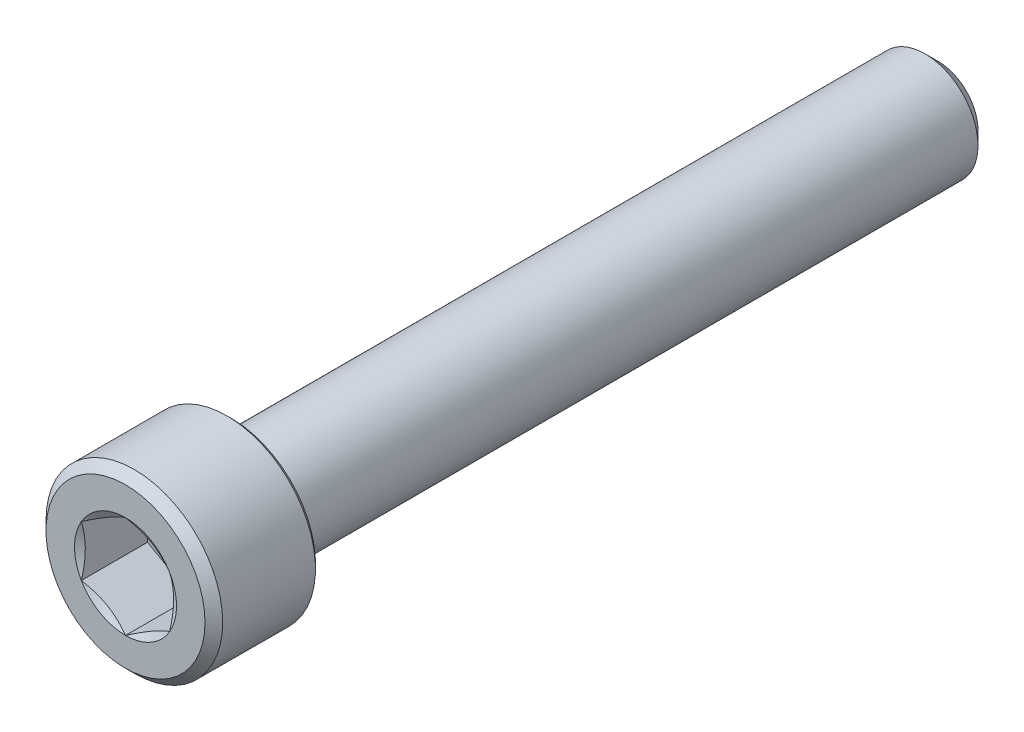
ISO-10303-21;
HEADER;
FILE_DESCRIPTION(('STEP AP214'),'2;1');
FILE_NAME('part.step','',(''),(''),'','','');
FILE_SCHEMA(('AUTOMOTIVE_DESIGN { 1 0 10303 214 1 1 1 1 }'));
ENDSEC;
DATA;
#1=APPLICATION_CONTEXT('core data for automotive mechanical design processes');
#2=APPLICATION_PROTOCOL_DEFINITION('international standard','automotive_design',2000,#1);
#3=PRODUCT_CONTEXT('',#1,'mechanical');
#4=PRODUCT('Part','Part','',(#3));
#5=PRODUCT_RELATED_PRODUCT_CATEGORY('part','',(#4));
#6=PRODUCT_DEFINITION_FORMATION('','',#4);
#7=PRODUCT_DEFINITION_CONTEXT('part definition',#1,'design');
#8=PRODUCT_DEFINITION('design','',#6,#7);
#9=PRODUCT_DEFINITION_SHAPE('','',#8);
#10=(LENGTH_UNIT() NAMED_UNIT(*) SI_UNIT(.MILLI.,.METRE.));
#11=(NAMED_UNIT(*) PLANE_ANGLE_UNIT() SI_UNIT($,.RADIAN.));
#12=(NAMED_UNIT(*) SI_UNIT($,.STERADIAN.) SOLID_ANGLE_UNIT());
#13=UNCERTAINTY_MEASURE_WITH_UNIT(LENGTH_MEASURE(1.E-05),#10,'distance_accuracy_value','');
#14=(GEOMETRIC_REPRESENTATION_CONTEXT(3) GLOBAL_UNCERTAINTY_ASSIGNED_CONTEXT((#13)) GLOBAL_UNIT_ASSIGNED_CONTEXT((#10,
#11,#12)) REPRESENTATION_CONTEXT('',''));
#15=CARTESIAN_POINT('',(0.,0.,0.));
#16=DIRECTION('',(0.,0.,1.));
#17=DIRECTION('',(1.,0.,0.));
#18=AXIS2_PLACEMENT_3D('',#15,#16,#17);
#19=CARTESIAN_POINT('',(-4.75000000000003,0.,17.));
#20=DIRECTION('',(0.,0.,-1.));
#21=DIRECTION('',(-1.,0.,0.));
#22=AXIS2_PLACEMENT_3D('',#19,#20,#21);
#23=PLANE('',#22);
#24=CARTESIAN_POINT('',(0.,0.,17.));
#25=DIRECTION('',(0.,0.,-1.));
#26=DIRECTION('',(-1.,0.,0.));
#27=AXIS2_PLACEMENT_3D('',#24,#25,#26);
#28=CIRCLE('',#27,3.);
#29=CARTESIAN_POINT('',(-3.,0.,17.));
#30=VERTEX_POINT('',#29);
#31=EDGE_CURVE('E12',#30,#30,#28,.T.);
#32=ORIENTED_EDGE('',*,*,#31,.F.);
#33=EDGE_LOOP('',(#32));
#34=FACE_BOUND('',#33,.T.);
#35=CARTESIAN_POINT('',(0.,0.,17.));
#36=DIRECTION('',(0.,0.,-1.));
#37=DIRECTION('',(-1.,0.,0.));
#38=AXIS2_PLACEMENT_3D('',#35,#36,#37);
#39=CIRCLE('',#38,4.74999999999999);
#40=CARTESIAN_POINT('',(-4.74999999999999,0.,17.));
#41=VERTEX_POINT('',#40);
#42=EDGE_CURVE('E289',#41,#41,#39,.T.);
#43=ORIENTED_EDGE('',*,*,#42,.T.);
#44=EDGE_LOOP('',(#43));
#45=FACE_BOUND('',#44,.T.);
#46=ADVANCED_FACE('F43',(#34,#45),#23,.T.);
#47=CARTESIAN_POINT('',(0.,0.,19.25));
#48=DIRECTION('',(0.,0.,1.));
#49=DIRECTION('',(1.,0.,0.));
#50=AXIS2_PLACEMENT_3D('',#47,#48,#49);
#51=PLANE('',#50);
#52=DIRECTION('',(-0.866025403784439,0.5,0.));
#53=VECTOR('',#52,1.);
#54=CARTESIAN_POINT('',(2.50000000000006,1.44337567297405,19.25));
#55=LINE('',#54,#53);
#56=CARTESIAN_POINT('',(2.50000000000006,1.44337567297405,19.25));
#57=VERTEX_POINT('',#56);
#58=CARTESIAN_POINT('',(0.,2.88675134594812,19.25));
#59=VERTEX_POINT('',#58);
#60=EDGE_CURVE('E112',#57,#59,#55,.T.);
#61=ORIENTED_EDGE('',*,*,#60,.T.);
#62=DIRECTION('',(-0.866025403784438,-0.5,0.));
#63=VECTOR('',#62,1.);
#64=CARTESIAN_POINT('',(0.,2.88675134594812,19.25));
#65=LINE('',#64,#63);
#66=CARTESIAN_POINT('',(-2.49999999999995,1.44337567297406,19.25));
#67=VERTEX_POINT('',#66);
#68=EDGE_CURVE('E240',#59,#67,#65,.T.);
#69=ORIENTED_EDGE('',*,*,#68,.T.);
#70=DIRECTION('',(0.,-1.,0.));
#71=VECTOR('',#70,1.);
#72=CARTESIAN_POINT('',(-2.49999999999995,1.44337567297406,19.25));
#73=LINE('',#72,#71);
#74=CARTESIAN_POINT('',(-2.49999999999995,-1.44337567297408,19.25));
#75=VERTEX_POINT('',#74);
#76=EDGE_CURVE('E246',#67,#75,#73,.T.);
#77=ORIENTED_EDGE('',*,*,#76,.T.);
#78=DIRECTION('',(0.866025403784439,-0.5,0.));
#79=VECTOR('',#78,1.);
#80=CARTESIAN_POINT('',(-2.49999999999995,-1.44337567297408,19.25));
#81=LINE('',#80,#79);
#82=CARTESIAN_POINT('',(0.,-2.88675134594814,19.2499999999994));
#83=VERTEX_POINT('',#82);
#84=EDGE_CURVE('E249',#75,#83,#81,.T.);
#85=ORIENTED_EDGE('',*,*,#84,.T.);
#86=DIRECTION('',(0.866025403784439,0.5,0.));
#87=VECTOR('',#86,1.);
#88=CARTESIAN_POINT('',(0.,-2.88675134594814,19.2499999999994));
#89=LINE('',#88,#87);
#90=CARTESIAN_POINT('',(2.50000000000006,-1.44337567297409,19.25));
#91=VERTEX_POINT('',#90);
#92=EDGE_CURVE('E255',#83,#91,#89,.T.);
#93=ORIENTED_EDGE('',*,*,#92,.T.);
#94=DIRECTION('',(0.,1.,0.));
#95=VECTOR('',#94,1.);
#96=CARTESIAN_POINT('',(2.50000000000006,-1.44337567297409,19.25));
#97=LINE('',#96,#95);
#98=EDGE_CURVE('E242',#91,#57,#97,.T.);
#99=ORIENTED_EDGE('',*,*,#98,.T.);
#100=EDGE_LOOP('',(#61,#69,#77,#85,#93,#99));
#101=FACE_BOUND('',#100,.T.);
#102=ADVANCED_FACE('F229',(#101),#51,.T.);
#103=CARTESIAN_POINT('',(0.,2.88675134594812,19.25));
#104=DIRECTION('',(-0.5,0.866025403784438,0.));
#105=DIRECTION('',(-0.866025403784438,-0.5,0.));
#106=AXIS2_PLACEMENT_3D('',#103,#104,#105);
#107=PLANE('',#106);
#108=DIRECTION('',(0.,0.,1.));
#109=VECTOR('',#108,1.);
#110=CARTESIAN_POINT('',(0.,2.88675134594812,19.25));
#111=LINE('',#110,#109);
#112=CARTESIAN_POINT('',(0.,2.88675134594819,22.9999999999999));
#113=VERTEX_POINT('',#112);
#114=EDGE_CURVE('E66',#59,#113,#111,.T.);
#115=ORIENTED_EDGE('',*,*,#114,.T.);
#116=CARTESIAN_POINT('',(0.000199999999894729,2.88686681600205,23.0000666706665));
#117=CARTESIAN_POINT('',(-0.10966323473493,2.82343724785376,22.963430626415));
#118=CARTESIAN_POINT('',(-0.22047479989656,2.75946016087833,22.9301112252724));
#119=CARTESIAN_POINT('',(-0.444016833466083,2.63039810762174,22.8719512918652));
#120=CARTESIAN_POINT('',(-0.556751274528445,2.56531084772745,22.8471313354551));
#121=CARTESIAN_POINT('',(-0.780822993875343,2.43594298024475,22.8084946577485));
#122=CARTESIAN_POINT('',(-0.892125791767446,2.37168227992019,22.7944208024932));
#123=CARTESIAN_POINT('',(-1.11525522746837,2.24285844015412,22.77761815866));
#124=CARTESIAN_POINT('',(-1.22708105401424,2.1782957690955,22.7748754575104));
#125=CARTESIAN_POINT('',(-1.43604197555149,2.05765212479586,22.7805747663149));
#126=CARTESIAN_POINT('',(-1.53320831755768,2.00155311108242,22.7876174006891));
#127=CARTESIAN_POINT('',(-1.72690794971093,1.88972057631682,22.8099404254325));
#128=CARTESIAN_POINT('',(-1.82344056965966,1.83398744220384,22.8252284447477));
#129=CARTESIAN_POINT('',(-2.01753972174042,1.72192424450053,22.8634481001518));
#130=CARTESIAN_POINT('',(-2.1150816817821,1.66560836761318,22.8865417824329));
#131=CARTESIAN_POINT('',(-2.30871060807606,1.55381665489446,22.9389556628853));
#132=CARTESIAN_POINT('',(-2.40480005588614,1.49833938633503,22.968263541932));
#133=CARTESIAN_POINT('',(-2.50019999999995,1.44326020292024,23.0000666706666));
#134=B_SPLINE_CURVE_WITH_KNOTS('',3,(#116,#117,#118,#119,#120,#121,#122,#123,#124,#125,#126,
#127,#128,#129,#130,#131,#132,#133),.UNSPECIFIED.,.F.,.F.,(4,2,2,2,2,2,2,2,4),(0.,
0.396285827362194,0.793524330152086,1.18093086852115,1.5678616013447,1.90479741793724,
2.24204551660453,2.58677531536753,2.93082800105252),.UNSPECIFIED.);
#135=CARTESIAN_POINT('',(-2.49999999999995,1.44337567297408,23.));
#136=VERTEX_POINT('',#135);
#137=EDGE_CURVE('E127',#113,#136,#134,.T.);
#138=ORIENTED_EDGE('',*,*,#137,.T.);
#139=DIRECTION('',(0.,0.,1.));
#140=VECTOR('',#139,1.);
#141=CARTESIAN_POINT('',(-2.49999999999995,1.44337567297406,19.25));
#142=LINE('',#141,#140);
#143=EDGE_CURVE('E269',#67,#136,#142,.T.);
#144=ORIENTED_EDGE('',*,*,#143,.F.);
#145=ORIENTED_EDGE('',*,*,#68,.F.);
#146=EDGE_LOOP('',(#115,#138,#144,#145));
#147=FACE_BOUND('',#146,.T.);
#148=ADVANCED_FACE('F167',(#147),#107,.F.);
#149=CARTESIAN_POINT('',(-2.49999999999995,1.44337567297406,19.25));
#150=DIRECTION('',(-1.,0.,0.));
#151=DIRECTION('',(0.,-1.,0.));
#152=AXIS2_PLACEMENT_3D('',#149,#150,#151);
#153=PLANE('',#152);
#154=ORIENTED_EDGE('',*,*,#143,.T.);
#155=CARTESIAN_POINT('',(-2.49999999999995,-3.73786280358436,23.9295882218481));
#156=CARTESIAN_POINT('',(-2.49999999999995,-3.6299041938339,23.8777937660757));
#157=CARTESIAN_POINT('',(-2.49999999999995,-3.5216825821562,23.8265372889182));
#158=CARTESIAN_POINT('',(-2.49999999999995,-3.3045731818414,23.725405478066));
#159=CARTESIAN_POINT('',(-2.49999999999995,-3.19568527756434,23.67553039293));
#160=CARTESIAN_POINT('',(-2.49999999999995,-2.97647878742819,23.57718792422));
#161=CARTESIAN_POINT('',(-2.49999999999995,-2.86615552972882,23.5287309150564));
#162=CARTESIAN_POINT('',(-2.49999999999995,-2.64458325378208,23.4339898302576));
#163=CARTESIAN_POINT('',(-2.49999999999995,-2.53333428402513,23.3877056416391));
#164=CARTESIAN_POINT('',(-2.49999999999994,-2.30680312539528,23.2967102106624));
#165=CARTESIAN_POINT('',(-2.49999999999994,-2.19149153465735,23.2520717337127));
#166=CARTESIAN_POINT('',(-2.49999999999995,-1.95947357141998,23.1665060597908));
#167=CARTESIAN_POINT('',(-2.49999999999995,-1.84276703891858,23.1255792932719));
#168=CARTESIAN_POINT('',(-2.49999999999994,-1.60804308504337,23.0486074115298));
#169=CARTESIAN_POINT('',(-2.49999999999992,-1.4900294060755,23.0125510068305));
#170=CARTESIAN_POINT('',(-2.49999999999998,-1.25231072628281,22.9465529230494));
#171=CARTESIAN_POINT('',(-2.50000000000006,-1.13260615342754,22.9166097253317));
#172=CARTESIAN_POINT('',(-2.50000000000006,-0.891755040559598,22.8644342528939));
#173=CARTESIAN_POINT('',(-2.49999999999998,-0.770611999342791,22.8421861409444));
#174=CARTESIAN_POINT('',(-2.49999999999992,-0.526970585180102,22.8068576846702));
#175=CARTESIAN_POINT('',(-2.49999999999994,-0.404472304392252,22.7937767208128));
#176=CARTESIAN_POINT('',(-2.49999999999995,-0.160266398285745,22.7779962179178));
#177=CARTESIAN_POINT('',(-2.49999999999995,-0.0385668852681152,22.7751741710629));
#178=CARTESIAN_POINT('',(-2.49999999999994,0.204641911565312,22.779835787442));
#179=CARTESIAN_POINT('',(-2.49999999999995,0.326151183135712,22.7873200888061));
#180=CARTESIAN_POINT('',(-2.49999999999995,0.536550507375678,22.8086986241475));
#181=CARTESIAN_POINT('',(-2.49999999999995,0.625673194353573,22.8204088062497));
#182=CARTESIAN_POINT('',(-2.49999999999995,0.803173287782045,22.8485682080933));
#183=CARTESIAN_POINT('',(-2.49999999999995,0.891550562549707,22.8650182478381));
#184=CARTESIAN_POINT('',(-2.49999999999995,1.15551872114666,22.920608136683));
#185=CARTESIAN_POINT('',(-2.49999999999995,1.3298084508478,22.9659720627379));
#186=CARTESIAN_POINT('',(-2.49999999999995,1.59042392622864,23.0434741103048));
#187=CARTESIAN_POINT('',(-2.49999999999994,1.67812347575765,23.0712456822263));
#188=CARTESIAN_POINT('',(-2.49999999999995,1.85261472109395,23.1293570437727));
#189=CARTESIAN_POINT('',(-2.49999999999995,1.93940694599717,23.1596952306279));
#190=CARTESIAN_POINT('',(-2.49999999999994,2.11219305997022,23.2225002270918));
#191=CARTESIAN_POINT('',(-2.49999999999992,2.19818709089973,23.2549666498558));
#192=CARTESIAN_POINT('',(-2.49999999999997,2.36949800121505,23.3216764490245));
#193=CARTESIAN_POINT('',(-2.50000000000004,2.45481476336808,23.3559201256526));
#194=CARTESIAN_POINT('',(-2.50000000000008,2.67258848239185,23.4455229254076));
#195=CARTESIAN_POINT('',(-2.49999999999998,2.80460967953055,23.5019397684451));
#196=CARTESIAN_POINT('',(-2.49999999999991,3.06746265041963,23.6174875943061));
#197=CARTESIAN_POINT('',(-2.49999999999994,3.19829433418386,23.676618780455));
#198=CARTESIAN_POINT('',(-2.49999999999996,3.45901422190792,23.7969788964102));
#199=CARTESIAN_POINT('',(-2.49999999999995,3.58890225741746,23.8582081901135));
#200=CARTESIAN_POINT('',(-2.49999999999994,3.84789608089141,23.9823019713333));
#201=CARTESIAN_POINT('',(-2.49999999999995,3.97700185138093,24.045166495214));
#202=CARTESIAN_POINT('',(-2.49999999999995,4.36367805353677,24.2358362644681));
#203=CARTESIAN_POINT('',(-2.49999999999995,4.62029579759498,24.3655717147873));
#204=CARTESIAN_POINT('',(-2.49999999999995,5.13177424186459,24.6283605546785));
#205=CARTESIAN_POINT('',(-2.49999999999995,5.38663516021295,24.7614135224999));
#206=CARTESIAN_POINT('',(-2.49999999999995,5.8711418917848,25.0171550199542));
#207=CARTESIAN_POINT('',(-2.49999999999995,6.1008971801589,25.1396364801015));
#208=CARTESIAN_POINT('',(-2.49999999999995,6.55966877222193,25.3859938636889));
#209=CARTESIAN_POINT('',(-2.49999999999995,6.78868504815703,25.5098698387339));
#210=CARTESIAN_POINT('',(-2.49999999999995,7.24556639201847,25.7583512135914));
#211=CARTESIAN_POINT('',(-2.49999999999994,7.47343290644597,25.8829539566817));
#212=CARTESIAN_POINT('',(-2.49999999999996,7.92870524335715,26.1329704268793));
#213=CARTESIAN_POINT('',(-2.49999999999999,8.15611108932577,26.2583841112048));
#214=CARTESIAN_POINT('',(-2.50000000000006,8.38335143636901,26.3840950351519));
#215=B_SPLINE_CURVE_WITH_KNOTS('',3,(#155,#156,#157,#158,#159,#160,#161,#162,#163,#164,#165,
#166,#167,#168,#169,#170,#171,#172,#173,#174,#175,#176,#177,#178,#179,#180,#181,#182,#183,#184,
#185,#186,#187,#188,#189,#190,#191,#192,#193,#194,#195,#196,#197,#198,#199,#200,#201,#202,#203,
#204,#205,#206,#207,#208,#209,#210,#211,#212,#213,#214),.UNSPECIFIED.,.F.,.F.,(4,2,2,2,2,2,2,2,
2,2,2,2,2,2,2,2,2,2,2,2,2,2,2,2,2,2,2,2,2,4),(0.,0.359225851171751,0.718515924652201,
1.07998546447263,1.44143618761008,1.81233728078374,2.18328133312377,2.55335021663077,
2.9233270558768,3.29253785179308,3.66172369336272,4.02648611163555,4.39127111563784,
4.66080405142566,4.93038364489896,5.46995614078321,5.745911740671,6.02169626937758,
6.29743080761802,6.57321207699327,7.00387918972036,7.43457861558234,7.86535312412182,
8.29613722044805,9.15873745151041,10.021228575181,10.8023128389285,11.5834261028714,
12.3625525890753,13.1416383019073),.UNSPECIFIED.);
#216=CARTESIAN_POINT('',(-2.49999999999995,-1.44337567297406,23.));
#217=VERTEX_POINT('',#216);
#218=EDGE_CURVE('E135',#136,#217,#215,.F.);
#219=ORIENTED_EDGE('',*,*,#218,.T.);
#220=DIRECTION('',(0.,0.,1.));
#221=VECTOR('',#220,1.);
#222=CARTESIAN_POINT('',(-2.49999999999995,-1.44337567297408,19.25));
#223=LINE('',#222,#221);
#224=EDGE_CURVE('E266',#75,#217,#223,.T.);
#225=ORIENTED_EDGE('',*,*,#224,.F.);
#226=ORIENTED_EDGE('',*,*,#76,.F.);
#227=EDGE_LOOP('',(#154,#219,#225,#226));
#228=FACE_BOUND('',#227,.T.);
#229=ADVANCED_FACE('F162',(#228),#153,.F.);
#230=CARTESIAN_POINT('',(-2.49999999999995,-1.44337567297408,19.25));
#231=DIRECTION('',(-0.5,-0.866025403784439,0.));
#232=DIRECTION('',(0.866025403784439,-0.5,0.));
#233=AXIS2_PLACEMENT_3D('',#230,#231,#232);
#234=PLANE('',#233);
#235=ORIENTED_EDGE('',*,*,#224,.T.);
#236=CARTESIAN_POINT('',(-2.50019999999995,-1.44326020292022,23.0000666706665));
#237=CARTESIAN_POINT('',(-2.39033676526508,-1.50668977106845,22.963430626415));
#238=CARTESIAN_POINT('',(-2.27952520010343,-1.57066685804386,22.9301112252725));
#239=CARTESIAN_POINT('',(-2.05598316653392,-1.69972891130041,22.8719512918653));
#240=CARTESIAN_POINT('',(-1.94324872547158,-1.76481617119469,22.8471313354552));
#241=CARTESIAN_POINT('',(-1.7191770061247,-1.8941840386774,22.8084946577485));
#242=CARTESIAN_POINT('',(-1.60787420823259,-1.95844473900197,22.7944208024931));
#243=CARTESIAN_POINT('',(-1.38474477253163,-2.08726857876805,22.7776181586602));
#244=CARTESIAN_POINT('',(-1.27291894598573,-2.15183124982667,22.774875457511));
#245=CARTESIAN_POINT('',(-1.06395802444845,-2.27247489412633,22.7805747663154));
#246=CARTESIAN_POINT('',(-0.96679168244226,-2.32857390783978,22.7876174006893));
#247=CARTESIAN_POINT('',(-0.773092050289012,-2.44040644260539,22.8099404254324));
#248=CARTESIAN_POINT('',(-0.676559430340289,-2.49613957671836,22.8252284447477));
#249=CARTESIAN_POINT('',(-0.482460278259579,-2.60820277442164,22.8634481001519));
#250=CARTESIAN_POINT('',(-0.384918318217942,-2.66451865130897,22.886541782433));
#251=CARTESIAN_POINT('',(-0.191289391924006,-2.77631036402766,22.9389556628853));
#252=CARTESIAN_POINT('',(-0.0951999441138962,-2.8317876325871,22.9682635419317));
#253=CARTESIAN_POINT('',(0.000200000000005751,-2.88686681600191,23.0000666706659));
#254=B_SPLINE_CURVE_WITH_KNOTS('',3,(#236,#237,#238,#239,#240,#241,#242,#243,#244,#245,#246,
#247,#248,#249,#250,#251,#252,#253),.UNSPECIFIED.,.F.,.F.,(4,2,2,2,2,2,2,2,4),(0.,
0.396285827362194,0.79352433015201,1.18093086852111,1.56786160134473,1.90479741793726,
2.24204551660452,2.58677531536739,2.93082800105231),.UNSPECIFIED.);
#255=CARTESIAN_POINT('',(0.,-2.88675134594805,22.9999999999994));
#256=VERTEX_POINT('',#255);
#257=EDGE_CURVE('E141',#217,#256,#254,.T.);
#258=ORIENTED_EDGE('',*,*,#257,.T.);
#259=DIRECTION('',(0.,0.,1.));
#260=VECTOR('',#259,1.);
#261=CARTESIAN_POINT('',(0.,-2.88675134594814,19.2499999999994));
#262=LINE('',#261,#260);
#263=EDGE_CURVE('E262',#83,#256,#262,.T.);
#264=ORIENTED_EDGE('',*,*,#263,.F.);
#265=ORIENTED_EDGE('',*,*,#84,.F.);
#266=EDGE_LOOP('',(#235,#258,#264,#265));
#267=FACE_BOUND('',#266,.T.);
#268=ADVANCED_FACE('F166',(#267),#234,.F.);
#269=CARTESIAN_POINT('',(0.,-2.88675134594814,19.2499999999994));
#270=DIRECTION('',(0.5,-0.866025403784439,0.));
#271=DIRECTION('',(0.866025403784439,0.5,0.));
#272=AXIS2_PLACEMENT_3D('',#269,#270,#271);
#273=PLANE('',#272);
#274=ORIENTED_EDGE('',*,*,#263,.T.);
#275=CARTESIAN_POINT('',(-0.000200000000005751,-2.88686681600191,23.0000666706659));
#276=CARTESIAN_POINT('',(0.109663234734952,-2.82343724785368,22.9634306264148));
#277=CARTESIAN_POINT('',(0.220474799896628,-2.75946016087828,22.9301112252724));
#278=CARTESIAN_POINT('',(0.444016833466147,-2.63039810762174,22.8719512918654));
#279=CARTESIAN_POINT('',(0.556751274528459,-2.56531084772747,22.8471313354552));
#280=CARTESIAN_POINT('',(0.78082299387531,-2.43594298024478,22.8084946577485));
#281=CARTESIAN_POINT('',(0.892125791767415,-2.37168227992022,22.7944208024931));
#282=CARTESIAN_POINT('',(1.11525522746835,-2.24285844015415,22.7776181586602));
#283=CARTESIAN_POINT('',(1.22708105401423,-2.17829576909552,22.774875457511));
#284=CARTESIAN_POINT('',(1.43604197555151,-2.05765212479586,22.7805747663154));
#285=CARTESIAN_POINT('',(1.53320831755773,-2.00155311108241,22.7876174006893));
#286=CARTESIAN_POINT('',(1.72690794971102,-1.88972057631678,22.8099404254324));
#287=CARTESIAN_POINT('',(1.82344056965975,-1.8339874422038,22.8252284447477));
#288=CARTESIAN_POINT('',(2.01753972174051,-1.72192424450049,22.8634481001519));
#289=CARTESIAN_POINT('',(2.11508168178217,-1.66560836761315,22.886541782433));
#290=CARTESIAN_POINT('',(2.30871060807613,-1.55381665489444,22.9389556628854));
#291=CARTESIAN_POINT('',(2.40480005588622,-1.49833938633501,22.968263541932));
#292=CARTESIAN_POINT('',(2.50020000000006,-1.44326020292021,23.0000666706665));
#293=B_SPLINE_CURVE_WITH_KNOTS('',3,(#275,#276,#277,#278,#279,#280,#281,#282,#283,#284,#285,
#286,#287,#288,#289,#290,#291,#292),.UNSPECIFIED.,.F.,.F.,(4,2,2,2,2,2,2,2,4),(0.,
0.396285827362142,0.793524330151915,1.18093086852098,1.56786160134455,1.90479741793714,
2.24204551660447,2.58677531536741,2.93082800105241),.UNSPECIFIED.);
#294=CARTESIAN_POINT('',(2.50000000000006,-1.44337567297403,23.));
#295=VERTEX_POINT('',#294);
#296=EDGE_CURVE('E121',#256,#295,#293,.T.);
#297=ORIENTED_EDGE('',*,*,#296,.T.);
#298=DIRECTION('',(0.,0.,1.));
#299=VECTOR('',#298,1.);
#300=CARTESIAN_POINT('',(2.50000000000006,-1.44337567297409,19.25));
#301=LINE('',#300,#299);
#302=EDGE_CURVE('E118',#91,#295,#301,.T.);
#303=ORIENTED_EDGE('',*,*,#302,.F.);
#304=ORIENTED_EDGE('',*,*,#92,.F.);
#305=EDGE_LOOP('',(#274,#297,#303,#304));
#306=FACE_BOUND('',#305,.T.);
#307=ADVANCED_FACE('F173',(#306),#273,.F.);
#308=CARTESIAN_POINT('',(2.50000000000006,-1.44337567297409,19.25));
#309=DIRECTION('',(1.,0.,0.));
#310=DIRECTION('',(0.,0.,-1.));
#311=AXIS2_PLACEMENT_3D('',#308,#309,#310);
#312=PLANE('',#311);
#313=ORIENTED_EDGE('',*,*,#302,.T.);
#314=CARTESIAN_POINT('',(2.50000000000006,-3.73786280358433,23.9295882218481));
#315=CARTESIAN_POINT('',(2.50000000000006,-3.62990419383387,23.8777937660757));
#316=CARTESIAN_POINT('',(2.50000000000006,-3.52168258215617,23.8265372889182));
#317=CARTESIAN_POINT('',(2.50000000000006,-3.30457318184136,23.725405478066));
#318=CARTESIAN_POINT('',(2.50000000000006,-3.19568527756431,23.67553039293));
#319=CARTESIAN_POINT('',(2.50000000000006,-2.97647878742816,23.57718792422));
#320=CARTESIAN_POINT('',(2.50000000000006,-2.86615552972878,23.5287309150565));
#321=CARTESIAN_POINT('',(2.50000000000006,-2.64458325378204,23.4339898302576));
#322=CARTESIAN_POINT('',(2.50000000000006,-2.53333428402509,23.3877056416392));
#323=CARTESIAN_POINT('',(2.50000000000006,-2.30680312539524,23.2967102106624));
#324=CARTESIAN_POINT('',(2.50000000000006,-2.1914915346573,23.2520717337127));
#325=CARTESIAN_POINT('',(2.50000000000006,-1.95947357141994,23.1665060597908));
#326=CARTESIAN_POINT('',(2.50000000000005,-1.84276703891853,23.125579293272));
#327=CARTESIAN_POINT('',(2.50000000000007,-1.60804308504332,23.0486074115299));
#328=CARTESIAN_POINT('',(2.50000000000009,-1.49002940607545,23.0125510068305));
#329=CARTESIAN_POINT('',(2.50000000000003,-1.25231072628277,22.9465529230495));
#330=CARTESIAN_POINT('',(2.49999999999995,-1.13260615342751,22.9166097253317));
#331=CARTESIAN_POINT('',(2.49999999999995,-0.891755040559573,22.8644342528939));
#332=CARTESIAN_POINT('',(2.50000000000003,-0.77061199934276,22.8421861409445));
#333=CARTESIAN_POINT('',(2.50000000000009,-0.526970585180067,22.8068576846703));
#334=CARTESIAN_POINT('',(2.50000000000007,-0.404472304392218,22.7937767208129));
#335=CARTESIAN_POINT('',(2.50000000000005,-0.160266398285715,22.7779962179178));
#336=CARTESIAN_POINT('',(2.50000000000006,-0.0385668852680854,22.775174171063));
#337=CARTESIAN_POINT('',(2.50000000000006,0.204641911565342,22.779835787442));
#338=CARTESIAN_POINT('',(2.50000000000006,0.326151183135744,22.7873200888061));
#339=CARTESIAN_POINT('',(2.50000000000006,0.536550507375701,22.8086986241475));
#340=CARTESIAN_POINT('',(2.50000000000006,0.625673194353588,22.8204088062498));
#341=CARTESIAN_POINT('',(2.50000000000006,0.80317328778205,22.8485682080933));
#342=CARTESIAN_POINT('',(2.50000000000006,0.891550562549711,22.8650182478381));
#343=CARTESIAN_POINT('',(2.50000000000006,1.15551872114666,22.9206081366831));
#344=CARTESIAN_POINT('',(2.50000000000006,1.3298084508478,22.9659720627379));
#345=CARTESIAN_POINT('',(2.50000000000006,1.59042392622864,23.0434741103048));
#346=CARTESIAN_POINT('',(2.50000000000006,1.67812347575765,23.0712456822264));
#347=CARTESIAN_POINT('',(2.50000000000006,1.85261472109394,23.1293570437727));
#348=CARTESIAN_POINT('',(2.50000000000005,1.93940694599716,23.159695230628));
#349=CARTESIAN_POINT('',(2.50000000000006,2.11219305997021,23.2225002270918));
#350=CARTESIAN_POINT('',(2.50000000000008,2.19818709089972,23.2549666498558));
#351=CARTESIAN_POINT('',(2.50000000000003,2.36949800121504,23.3216764490246));
#352=CARTESIAN_POINT('',(2.49999999999996,2.45481476336808,23.3559201256526));
#353=CARTESIAN_POINT('',(2.49999999999992,2.67258848239185,23.4455229254076));
#354=CARTESIAN_POINT('',(2.50000000000002,2.80460967953053,23.5019397684452));
#355=CARTESIAN_POINT('',(2.50000000000009,3.06746265041961,23.6174875943062));
#356=CARTESIAN_POINT('',(2.50000000000007,3.19829433418385,23.6766187804551));
#357=CARTESIAN_POINT('',(2.50000000000005,3.45901422190791,23.7969788964103));
#358=CARTESIAN_POINT('',(2.50000000000006,3.58890225741744,23.8582081901136));
#359=CARTESIAN_POINT('',(2.50000000000006,3.84789608089139,23.9823019713333));
#360=CARTESIAN_POINT('',(2.50000000000006,3.97700185138091,24.0451664952141));
#361=CARTESIAN_POINT('',(2.50000000000006,4.36367805353676,24.2358362644681));
#362=CARTESIAN_POINT('',(2.50000000000006,4.62029579759497,24.3655717147873));
#363=CARTESIAN_POINT('',(2.50000000000006,5.13177424186459,24.6283605546785));
#364=CARTESIAN_POINT('',(2.50000000000006,5.38663516021295,24.7614135224999));
#365=CARTESIAN_POINT('',(2.50000000000006,5.8711418917848,25.0171550199542));
#366=CARTESIAN_POINT('',(2.50000000000006,6.1008971801589,25.1396364801015));
#367=CARTESIAN_POINT('',(2.50000000000006,6.55966877222193,25.3859938636889));
#368=CARTESIAN_POINT('',(2.50000000000005,6.78868504815703,25.5098698387339));
#369=CARTESIAN_POINT('',(2.50000000000006,7.24556639201847,25.7583512135914));
#370=CARTESIAN_POINT('',(2.50000000000007,7.47343290644597,25.8829539566817));
#371=CARTESIAN_POINT('',(2.50000000000005,7.92870524335714,26.1329704268793));
#372=CARTESIAN_POINT('',(2.50000000000002,8.15611108932577,26.2583841112048));
#373=CARTESIAN_POINT('',(2.49999999999995,8.38335143636901,26.3840950351519));
#374=B_SPLINE_CURVE_WITH_KNOTS('',3,(#314,#315,#316,#317,#318,#319,#320,#321,#322,#323,#324,
#325,#326,#327,#328,#329,#330,#331,#332,#333,#334,#335,#336,#337,#338,#339,#340,#341,#342,#343,
#344,#345,#346,#347,#348,#349,#350,#351,#352,#353,#354,#355,#356,#357,#358,#359,#360,#361,#362,
#363,#364,#365,#366,#367,#368,#369,#370,#371,#372,#373),.UNSPECIFIED.,.F.,.F.,(4,2,2,2,2,2,2,2,
2,2,2,2,2,2,2,2,2,2,2,2,2,2,2,2,2,2,2,2,2,4),(0.,0.359225851171747,0.718515924652191,
1.07998546447262,1.44143618761008,1.81233728078374,2.18328133312378,2.55335021663077,
2.92332705587679,3.29253785179307,3.66172369336271,4.02648611163554,4.39127111563782,
4.66080405142563,4.93038364489892,5.46995614078316,5.74591174067095,6.02169626937753,
6.29743080761797,6.5732120769932,7.0038791897203,7.43457861558228,7.86535312412175,
8.29613722044799,9.15873745151034,10.0212285751809,10.8023128389285,11.5834261028713,
12.3625525890753,13.1416383019072),.UNSPECIFIED.);
#375=CARTESIAN_POINT('',(2.50000000000006,1.44337567297409,23.));
#376=VERTEX_POINT('',#375);
#377=EDGE_CURVE('E102',#295,#376,#374,.T.);
#378=ORIENTED_EDGE('',*,*,#377,.T.);
#379=DIRECTION('',(0.,0.,1.));
#380=VECTOR('',#379,1.);
#381=CARTESIAN_POINT('',(2.50000000000006,1.44337567297405,19.25));
#382=LINE('',#381,#380);
#383=EDGE_CURVE('E117',#57,#376,#382,.T.);
#384=ORIENTED_EDGE('',*,*,#383,.F.);
#385=ORIENTED_EDGE('',*,*,#98,.F.);
#386=EDGE_LOOP('',(#313,#378,#384,#385));
#387=FACE_BOUND('',#386,.T.);
#388=ADVANCED_FACE('F115',(#387),#312,.F.);
#389=CARTESIAN_POINT('',(2.50000000000006,1.44337567297405,19.25));
#390=DIRECTION('',(0.5,0.866025403784439,0.));
#391=DIRECTION('',(-0.866025403784439,0.5,0.));
#392=AXIS2_PLACEMENT_3D('',#389,#390,#391);
#393=PLANE('',#392);
#394=ORIENTED_EDGE('',*,*,#383,.T.);
#395=CARTESIAN_POINT('',(2.50020000000006,1.44326020292024,23.0000666706666));
#396=CARTESIAN_POINT('',(2.39033676526519,1.50668977106844,22.9634306264151));
#397=CARTESIAN_POINT('',(2.27952520010353,1.57066685804384,22.9301112252725));
#398=CARTESIAN_POINT('',(2.05598316653401,1.69972891130039,22.8719512918653));
#399=CARTESIAN_POINT('',(1.94324872547168,1.76481617119467,22.8471313354552));
#400=CARTESIAN_POINT('',(1.71917700612481,1.89418403867737,22.8084946577485));
#401=CARTESIAN_POINT('',(1.6078742082327,1.95844473900194,22.794420802493));
#402=CARTESIAN_POINT('',(1.38474477253174,2.08726857876802,22.7776181586602));
#403=CARTESIAN_POINT('',(1.27291894598585,2.15183124982665,22.7748754575111));
#404=CARTESIAN_POINT('',(1.06395802444854,2.27247489412633,22.7805747663155));
#405=CARTESIAN_POINT('',(0.966791682442313,2.32857390783979,22.7876174006893));
#406=CARTESIAN_POINT('',(0.77309205028902,2.44040644260542,22.8099404254323));
#407=CARTESIAN_POINT('',(0.676559430340286,2.4961395767184,22.8252284447476));
#408=CARTESIAN_POINT('',(0.482460278259532,2.6082027744217,22.8634481001518));
#409=CARTESIAN_POINT('',(0.384918318217863,2.66451865130904,22.8865417824329));
#410=CARTESIAN_POINT('',(0.191289391923911,2.77631036402776,22.9389556628853));
#411=CARTESIAN_POINT('',(0.0951999441138159,2.83178763258722,22.9682635419319));
#412=CARTESIAN_POINT('',(-0.000200000000005751,2.88686681600205,23.0000666706665));
#413=B_SPLINE_CURVE_WITH_KNOTS('',3,(#395,#396,#397,#398,#399,#400,#401,#402,#403,#404,#405,
#406,#407,#408,#409,#410,#411,#412),.UNSPECIFIED.,.F.,.F.,(4,2,2,2,2,2,2,2,4),(0.,
0.396285827362228,0.793524330152033,1.18093086852112,1.56786160134475,1.90479741793735,
2.24204551660468,2.58677531536762,2.93082800105265),.UNSPECIFIED.);
#414=EDGE_CURVE('E108',#376,#113,#413,.T.);
#415=ORIENTED_EDGE('',*,*,#414,.T.);
#416=ORIENTED_EDGE('',*,*,#114,.F.);
#417=ORIENTED_EDGE('',*,*,#60,.F.);
#418=EDGE_LOOP('',(#394,#415,#416,#417));
#419=FACE_BOUND('',#418,.T.);
#420=ADVANCED_FACE('F123',(#419),#393,.F.);
#421=CARTESIAN_POINT('',(0.,0.,23.));
#422=DIRECTION('',(0.,0.,1.));
#423=DIRECTION('',(1.,0.,0.));
#424=AXIS2_PLACEMENT_3D('',#421,#422,#423);
#425=CONICAL_SURFACE('',#424,2.88675134594813,1.0471975511966);
#426=CARTESIAN_POINT('',(0.,0.,23.));
#427=DIRECTION('',(0.,0.,1.));
#428=DIRECTION('',(1.,0.,0.));
#429=AXIS2_PLACEMENT_3D('',#426,#427,#428);
#430=CIRCLE('',#429,2.88675134594813);
#431=EDGE_CURVE('E133',#113,#136,#430,.T.);
#432=ORIENTED_EDGE('',*,*,#431,.T.);
#433=ORIENTED_EDGE('',*,*,#137,.F.);
#434=EDGE_LOOP('',(#432,#433));
#435=FACE_BOUND('',#434,.T.);
#436=ADVANCED_FACE('F198',(#435),#425,.F.);
#437=EDGE_CURVE('E139',#136,#217,#430,.T.);
#438=ORIENTED_EDGE('',*,*,#437,.T.);
#439=ORIENTED_EDGE('',*,*,#218,.F.);
#440=EDGE_LOOP('',(#438,#439));
#441=FACE_BOUND('',#440,.T.);
#442=ADVANCED_FACE('F352',(#441),#425,.F.);
#443=EDGE_CURVE('E335',#217,#256,#430,.T.);
#444=ORIENTED_EDGE('',*,*,#443,.T.);
#445=ORIENTED_EDGE('',*,*,#257,.F.);
#446=EDGE_LOOP('',(#444,#445));
#447=FACE_BOUND('',#446,.T.);
#448=ADVANCED_FACE('F350',(#447),#425,.F.);
#449=EDGE_CURVE('E107',#256,#295,#430,.T.);
#450=ORIENTED_EDGE('',*,*,#449,.T.);
#451=ORIENTED_EDGE('',*,*,#296,.F.);
#452=EDGE_LOOP('',(#450,#451));
#453=FACE_BOUND('',#452,.T.);
#454=ADVANCED_FACE('F347',(#453),#425,.F.);
#455=EDGE_CURVE('E52',#295,#376,#430,.T.);
#456=ORIENTED_EDGE('',*,*,#455,.T.);
#457=ORIENTED_EDGE('',*,*,#377,.F.);
#458=EDGE_LOOP('',(#456,#457));
#459=FACE_BOUND('',#458,.T.);
#460=ADVANCED_FACE('F100',(#459),#425,.F.);
#461=EDGE_CURVE('E46',#376,#113,#430,.T.);
#462=ORIENTED_EDGE('',*,*,#461,.T.);
#463=ORIENTED_EDGE('',*,*,#414,.F.);
#464=EDGE_LOOP('',(#462,#463));
#465=FACE_BOUND('',#464,.T.);
#466=ADVANCED_FACE('F109',(#465),#425,.F.);
#467=CARTESIAN_POINT('',(0.,5.00000000000007,23.));
#468=DIRECTION('',(0.,0.,1.));
#469=DIRECTION('',(1.,0.,0.));
#470=AXIS2_PLACEMENT_3D('',#467,#468,#469);
#471=PLANE('',#470);
#472=CARTESIAN_POINT('',(0.,0.,23.));
#473=DIRECTION('',(0.,0.,1.));
#474=DIRECTION('',(1.,0.,0.));
#475=AXIS2_PLACEMENT_3D('',#472,#473,#474);
#476=CIRCLE('',#475,4.49999999999999);
#477=CARTESIAN_POINT('',(4.49999999999999,0.,23.));
#478=VERTEX_POINT('',#477);
#479=EDGE_CURVE('E285',#478,#478,#476,.T.);
#480=ORIENTED_EDGE('',*,*,#479,.T.);
#481=EDGE_LOOP('',(#480));
#482=FACE_BOUND('',#481,.T.);
#483=ORIENTED_EDGE('',*,*,#461,.F.);
#484=ORIENTED_EDGE('',*,*,#455,.F.);
#485=ORIENTED_EDGE('',*,*,#449,.F.);
#486=ORIENTED_EDGE('',*,*,#443,.F.);
#487=ORIENTED_EDGE('',*,*,#437,.F.);
#488=ORIENTED_EDGE('',*,*,#431,.F.);
#489=EDGE_LOOP('',(#483,#484,#485,#486,#487,#488));
#490=FACE_BOUND('',#489,.T.);
#491=ADVANCED_FACE('F130',(#482,#490),#471,.T.);
#492=CARTESIAN_POINT('',(0.,0.,22.5));
#493=DIRECTION('',(0.,0.,-1.));
#494=DIRECTION('',(-1.,0.,0.));
#495=AXIS2_PLACEMENT_3D('',#492,#493,#494);
#496=CONICAL_SURFACE('',#495,5.,0.785398163397452);
#497=ORIENTED_EDGE('',*,*,#479,.F.);
#498=EDGE_LOOP('',(#497));
#499=FACE_BOUND('',#498,.T.);
#500=CARTESIAN_POINT('',(0.,0.,22.5));
#501=DIRECTION('',(0.,0.,1.));
#502=DIRECTION('',(1.,0.,0.));
#503=AXIS2_PLACEMENT_3D('',#500,#501,#502);
#504=CIRCLE('',#503,5.);
#505=CARTESIAN_POINT('',(5.,0.,22.5));
#506=VERTEX_POINT('',#505);
#507=EDGE_CURVE('E281',#506,#506,#504,.F.);
#508=ORIENTED_EDGE('',*,*,#507,.F.);
#509=EDGE_LOOP('',(#508));
#510=FACE_BOUND('',#509,.T.);
#511=ADVANCED_FACE('F203',(#499,#510),#496,.T.);
#512=CARTESIAN_POINT('',(0.,0.,-23.));
#513=DIRECTION('',(0.,0.,-1.));
#514=DIRECTION('',(-1.,0.,0.));
#515=AXIS2_PLACEMENT_3D('',#512,#513,#514);
#516=CYLINDRICAL_SURFACE('',#515,5.);
#517=CARTESIAN_POINT('',(0.,0.,17.25));
#518=DIRECTION('',(0.,0.,-1.));
#519=DIRECTION('',(-1.,0.,0.));
#520=AXIS2_PLACEMENT_3D('',#517,#518,#519);
#521=CIRCLE('',#520,5.);
#522=CARTESIAN_POINT('',(-5.,0.,17.25));
#523=VERTEX_POINT('',#522);
#524=EDGE_CURVE('E293',#523,#523,#521,.F.);
#525=ORIENTED_EDGE('',*,*,#524,.T.);
#526=EDGE_LOOP('',(#525));
#527=FACE_BOUND('',#526,.T.);
#528=ORIENTED_EDGE('',*,*,#507,.T.);
#529=EDGE_LOOP('',(#528));
#530=FACE_BOUND('',#529,.T.);
#531=ADVANCED_FACE('F199',(#527,#530),#516,.T.);
#532=CARTESIAN_POINT('',(0.,0.,17.));
#533=DIRECTION('',(0.,0.,1.));
#534=DIRECTION('',(1.,0.,0.));
#535=AXIS2_PLACEMENT_3D('',#532,#533,#534);
#536=CONICAL_SURFACE('',#535,4.74999999999999,0.785398163397448);
#537=ORIENTED_EDGE('',*,*,#524,.F.);
#538=EDGE_LOOP('',(#537));
#539=FACE_BOUND('',#538,.T.);
#540=ORIENTED_EDGE('',*,*,#42,.F.);
#541=EDGE_LOOP('',(#540));
#542=FACE_BOUND('',#541,.T.);
#543=ADVANCED_FACE('F202',(#539,#542),#536,.T.);
#544=CARTESIAN_POINT('',(0.,0.,-23.));
#545=DIRECTION('',(0.,0.,-1.));
#546=DIRECTION('',(-1.,0.,0.));
#547=AXIS2_PLACEMENT_3D('',#544,#545,#546);
#548=CYLINDRICAL_SURFACE('',#547,3.);
#549=CARTESIAN_POINT('',(0.,0.,-22.25));
#550=DIRECTION('',(0.,0.,-1.));
#551=DIRECTION('',(-1.,0.,0.));
#552=AXIS2_PLACEMENT_3D('',#549,#550,#551);
#553=CIRCLE('',#552,3.);
#554=CARTESIAN_POINT('',(-3.,0.,-22.25));
#555=VERTEX_POINT('',#554);
#556=EDGE_CURVE('E301',#555,#555,#553,.T.);
#557=ORIENTED_EDGE('',*,*,#556,.F.);
#558=EDGE_LOOP('',(#557));
#559=FACE_BOUND('',#558,.T.);
#560=ORIENTED_EDGE('',*,*,#31,.T.);
#561=EDGE_LOOP('',(#560));
#562=FACE_BOUND('',#561,.T.);
#563=ADVANCED_FACE('F213',(#559,#562),#548,.T.);
#564=CARTESIAN_POINT('',(0.,0.,-22.25));
#565=DIRECTION('',(0.,0.,1.));
#566=DIRECTION('',(1.,0.,0.));
#567=AXIS2_PLACEMENT_3D('',#564,#565,#566);
#568=CONICAL_SURFACE('',#567,3.,0.785398163397446);
#569=CARTESIAN_POINT('',(0.,0.,-23.));
#570=DIRECTION('',(0.,0.,-1.));
#571=DIRECTION('',(-1.,0.,0.));
#572=AXIS2_PLACEMENT_3D('',#569,#570,#571);
#573=CIRCLE('',#572,2.25);
#574=CARTESIAN_POINT('',(-2.25,0.,-23.));
#575=VERTEX_POINT('',#574);
#576=EDGE_CURVE('E296',#575,#575,#573,.T.);
#577=ORIENTED_EDGE('',*,*,#576,.F.);
#578=EDGE_LOOP('',(#577));
#579=FACE_BOUND('',#578,.T.);
#580=ORIENTED_EDGE('',*,*,#556,.T.);
#581=EDGE_LOOP('',(#580));
#582=FACE_BOUND('',#581,.T.);
#583=ADVANCED_FACE('F217',(#579,#582),#568,.T.);
#584=CARTESIAN_POINT('',(0.,3.00000000000006,-23.0000000000006));
#585=DIRECTION('',(0.,0.,-1.));
#586=DIRECTION('',(-1.,0.,0.));
#587=AXIS2_PLACEMENT_3D('',#584,#585,#586);
#588=PLANE('',#587);
#589=ORIENTED_EDGE('',*,*,#576,.T.);
#590=EDGE_LOOP('',(#589));
#591=FACE_BOUND('',#590,.T.);
#592=ADVANCED_FACE('F219',(#591),#588,.T.);
#593=CLOSED_SHELL('',(#46,#102,#148,#229,#268,#307,#388,#420,#436,#442,#448,#454,#460,#466,#491,
#511,#531,#543,#563,#583,#592));
#594=MANIFOLD_SOLID_BREP('B2',#593);
#595=ADVANCED_BREP_SHAPE_REPRESENTATION('',(#18,#594),#14);
#596=SHAPE_DEFINITION_REPRESENTATION(#9,#595);
ENDSEC;
END-ISO-10303-21;
